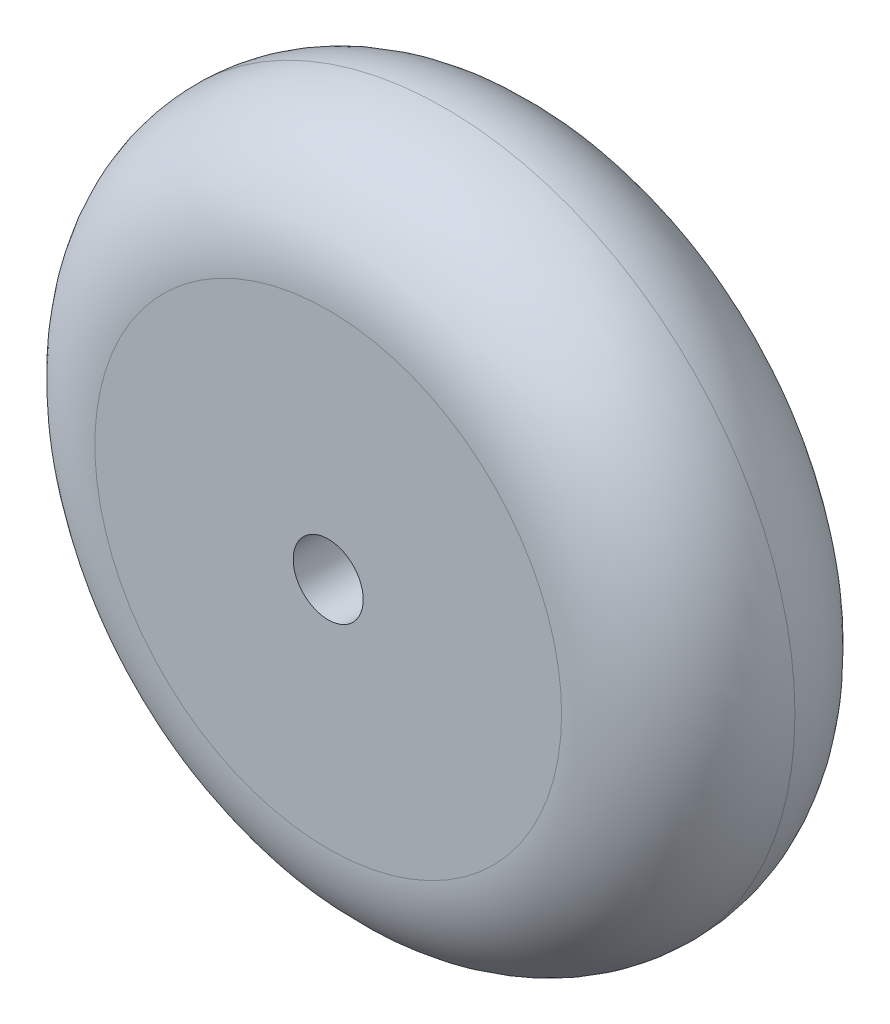
ISO-10303-21;
HEADER;
FILE_DESCRIPTION(('STEP AP214'),'2;1');
FILE_NAME('part.step','',(''),(''),'','','');
FILE_SCHEMA(('AUTOMOTIVE_DESIGN { 1 0 10303 214 1 1 1 1 }'));
ENDSEC;
DATA;
#1=APPLICATION_CONTEXT('core data for automotive mechanical design processes');
#2=APPLICATION_PROTOCOL_DEFINITION('international standard','automotive_design',2000,#1);
#3=PRODUCT_CONTEXT('',#1,'mechanical');
#4=PRODUCT('Part','Part','',(#3));
#5=PRODUCT_RELATED_PRODUCT_CATEGORY('part','',(#4));
#6=PRODUCT_DEFINITION_FORMATION('','',#4);
#7=PRODUCT_DEFINITION_CONTEXT('part definition',#1,'design');
#8=PRODUCT_DEFINITION('design','',#6,#7);
#9=PRODUCT_DEFINITION_SHAPE('','',#8);
#10=(LENGTH_UNIT() NAMED_UNIT(*) SI_UNIT(.MILLI.,.METRE.));
#11=(NAMED_UNIT(*) PLANE_ANGLE_UNIT() SI_UNIT($,.RADIAN.));
#12=(NAMED_UNIT(*) SI_UNIT($,.STERADIAN.) SOLID_ANGLE_UNIT());
#13=UNCERTAINTY_MEASURE_WITH_UNIT(LENGTH_MEASURE(1.E-05),#10,'distance_accuracy_value','');
#14=(GEOMETRIC_REPRESENTATION_CONTEXT(3) GLOBAL_UNCERTAINTY_ASSIGNED_CONTEXT((#13)) GLOBAL_UNIT_ASSIGNED_CONTEXT((#10,
#11,#12)) REPRESENTATION_CONTEXT('',''));
#15=CARTESIAN_POINT('',(0.,0.,0.));
#16=DIRECTION('',(0.,0.,1.));
#17=DIRECTION('',(1.,0.,0.));
#18=AXIS2_PLACEMENT_3D('',#15,#16,#17);
#19=CARTESIAN_POINT('',(0.,0.,10.));
#20=DIRECTION('',(0.,0.,1.));
#21=DIRECTION('',(1.,0.,0.));
#22=AXIS2_PLACEMENT_3D('',#19,#20,#21);
#23=PLANE('',#22);
#24=CARTESIAN_POINT('',(0.,0.,10.));
#25=DIRECTION('',(0.,0.,1.));
#26=DIRECTION('',(1.,0.,0.));
#27=AXIS2_PLACEMENT_3D('',#24,#25,#26);
#28=CIRCLE('',#27,1.5);
#29=CARTESIAN_POINT('',(1.5,0.,10.));
#30=VERTEX_POINT('',#29);
#31=EDGE_CURVE('E48',#30,#30,#28,.T.);
#32=ORIENTED_EDGE('',*,*,#31,.F.);
#33=EDGE_LOOP('',(#32));
#34=FACE_BOUND('',#33,.T.);
#35=CARTESIAN_POINT('',(0.,0.,10.));
#36=DIRECTION('',(0.,0.,1.));
#37=DIRECTION('',(1.,0.,0.));
#38=AXIS2_PLACEMENT_3D('',#35,#36,#37);
#39=CIRCLE('',#38,10.);
#40=CARTESIAN_POINT('',(10.,0.,10.));
#41=VERTEX_POINT('',#40);
#42=EDGE_CURVE('E41',#41,#41,#39,.T.);
#43=ORIENTED_EDGE('',*,*,#42,.T.);
#44=EDGE_LOOP('',(#43));
#45=FACE_BOUND('',#44,.T.);
#46=ADVANCED_FACE('F30',(#34,#45),#23,.T.);
#47=CARTESIAN_POINT('',(0.,0.,0.));
#48=DIRECTION('',(0.,0.,1.));
#49=DIRECTION('',(1.,0.,0.));
#50=AXIS2_PLACEMENT_3D('',#47,#48,#49);
#51=PLANE('',#50);
#52=CARTESIAN_POINT('',(0.,0.,0.));
#53=DIRECTION('',(0.,0.,1.));
#54=DIRECTION('',(1.,0.,0.));
#55=AXIS2_PLACEMENT_3D('',#52,#53,#54);
#56=CIRCLE('',#55,1.5);
#57=CARTESIAN_POINT('',(1.5,0.,0.));
#58=VERTEX_POINT('',#57);
#59=EDGE_CURVE('E45',#58,#58,#56,.T.);
#60=ORIENTED_EDGE('',*,*,#59,.T.);
#61=EDGE_LOOP('',(#60));
#62=FACE_BOUND('',#61,.T.);
#63=CARTESIAN_POINT('',(0.,0.,0.));
#64=DIRECTION('',(0.,0.,1.));
#65=DIRECTION('',(1.,0.,0.));
#66=AXIS2_PLACEMENT_3D('',#63,#64,#65);
#67=CIRCLE('',#66,10.);
#68=CARTESIAN_POINT('',(10.,0.,0.));
#69=VERTEX_POINT('',#68);
#70=EDGE_CURVE('E10',#69,#69,#67,.F.);
#71=ORIENTED_EDGE('',*,*,#70,.T.);
#72=EDGE_LOOP('',(#71));
#73=FACE_BOUND('',#72,.T.);
#74=ADVANCED_FACE('F54',(#62,#73),#51,.F.);
#75=CARTESIAN_POINT('',(0.,0.,5.));
#76=DIRECTION('',(0.,0.,1.));
#77=DIRECTION('',(1.,0.,0.));
#78=AXIS2_PLACEMENT_3D('',#75,#76,#77);
#79=TOROIDAL_SURFACE('',#78,10.,5.);
#80=CARTESIAN_POINT('',(0.,0.,5.));
#81=DIRECTION('',(0.,0.,1.));
#82=DIRECTION('',(1.,0.,0.));
#83=AXIS2_PLACEMENT_3D('',#80,#81,#82);
#84=CIRCLE('',#83,15.);
#85=CARTESIAN_POINT('',(15.,0.,5.));
#86=VERTEX_POINT('',#85);
#87=EDGE_CURVE('E37',#86,#86,#84,.F.);
#88=ORIENTED_EDGE('',*,*,#87,.F.);
#89=EDGE_LOOP('',(#88));
#90=FACE_BOUND('',#89,.T.);
#91=ORIENTED_EDGE('',*,*,#42,.F.);
#92=EDGE_LOOP('',(#91));
#93=FACE_BOUND('',#92,.T.);
#94=ADVANCED_FACE('F67',(#90,#93),#79,.T.);
#95=CARTESIAN_POINT('',(0.,0.,5.));
#96=DIRECTION('',(0.,0.,1.));
#97=DIRECTION('',(1.,0.,0.));
#98=AXIS2_PLACEMENT_3D('',#95,#96,#97);
#99=TOROIDAL_SURFACE('',#98,10.,5.);
#100=ORIENTED_EDGE('',*,*,#70,.F.);
#101=EDGE_LOOP('',(#100));
#102=FACE_BOUND('',#101,.T.);
#103=ORIENTED_EDGE('',*,*,#87,.T.);
#104=EDGE_LOOP('',(#103));
#105=FACE_BOUND('',#104,.T.);
#106=ADVANCED_FACE('F32',(#102,#105),#99,.T.);
#107=CARTESIAN_POINT('',(0.,0.,0.));
#108=DIRECTION('',(0.,0.,1.));
#109=DIRECTION('',(1.,0.,0.));
#110=AXIS2_PLACEMENT_3D('',#107,#108,#109);
#111=CYLINDRICAL_SURFACE('',#110,1.5);
#112=ORIENTED_EDGE('',*,*,#59,.F.);
#113=EDGE_LOOP('',(#112));
#114=FACE_BOUND('',#113,.T.);
#115=ORIENTED_EDGE('',*,*,#31,.T.);
#116=EDGE_LOOP('',(#115));
#117=FACE_BOUND('',#116,.T.);
#118=ADVANCED_FACE('F56',(#114,#117),#111,.F.);
#119=CLOSED_SHELL('',(#46,#74,#94,#106,#118));
#120=MANIFOLD_SOLID_BREP('B2',#119);
#121=ADVANCED_BREP_SHAPE_REPRESENTATION('',(#18,#120),#14);
#122=SHAPE_DEFINITION_REPRESENTATION(#9,#121);
ENDSEC;
END-ISO-10303-21;
